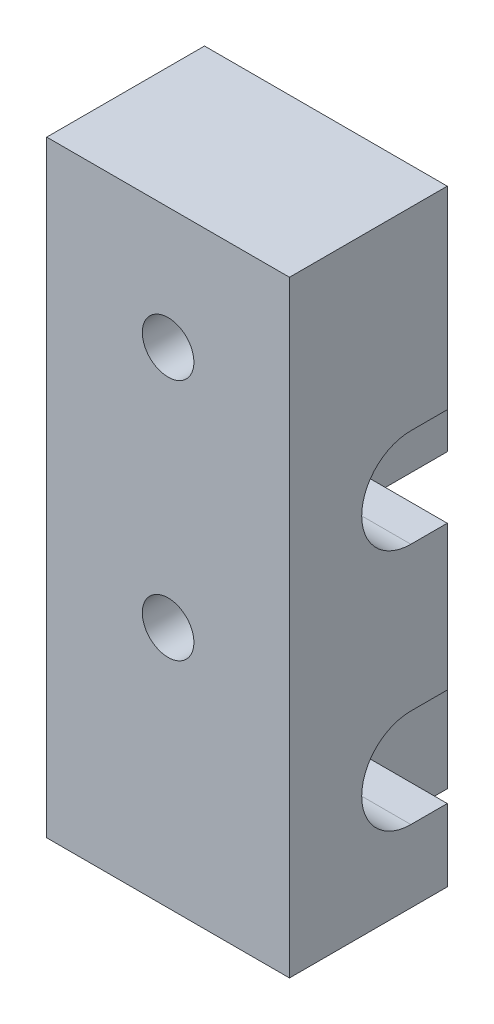
ISO-10303-21;
HEADER;
FILE_DESCRIPTION(('STEP AP214'),'2;1');
FILE_NAME('part.step','',(''),(''),'','','');
FILE_SCHEMA(('AUTOMOTIVE_DESIGN { 1 0 10303 214 1 1 1 1 }'));
ENDSEC;
DATA;
#1=APPLICATION_CONTEXT('core data for automotive mechanical design processes');
#2=APPLICATION_PROTOCOL_DEFINITION('international standard','automotive_design',2000,#1);
#3=PRODUCT_CONTEXT('',#1,'mechanical');
#4=PRODUCT('Part','Part','',(#3));
#5=PRODUCT_RELATED_PRODUCT_CATEGORY('part','',(#4));
#6=PRODUCT_DEFINITION_FORMATION('','',#4);
#7=PRODUCT_DEFINITION_CONTEXT('part definition',#1,'design');
#8=PRODUCT_DEFINITION('design','',#6,#7);
#9=PRODUCT_DEFINITION_SHAPE('','',#8);
#10=(LENGTH_UNIT() NAMED_UNIT(*) SI_UNIT(.MILLI.,.METRE.));
#11=(NAMED_UNIT(*) PLANE_ANGLE_UNIT() SI_UNIT($,.RADIAN.));
#12=(NAMED_UNIT(*) SI_UNIT($,.STERADIAN.) SOLID_ANGLE_UNIT());
#13=UNCERTAINTY_MEASURE_WITH_UNIT(LENGTH_MEASURE(1.E-05),#10,'distance_accuracy_value','');
#14=(GEOMETRIC_REPRESENTATION_CONTEXT(3) GLOBAL_UNCERTAINTY_ASSIGNED_CONTEXT((#13)) GLOBAL_UNIT_ASSIGNED_CONTEXT((#10,
#11,#12)) REPRESENTATION_CONTEXT('',''));
#15=CARTESIAN_POINT('',(0.,0.,0.));
#16=DIRECTION('',(0.,0.,1.));
#17=DIRECTION('',(1.,0.,0.));
#18=AXIS2_PLACEMENT_3D('',#15,#16,#17);
#19=CARTESIAN_POINT('',(20.,30.,10.));
#20=DIRECTION('',(-1.,0.,0.));
#21=DIRECTION('',(0.,0.,-1.));
#22=AXIS2_PLACEMENT_3D('',#19,#20,#21);
#23=CYLINDRICAL_SURFACE('',#22,4.05);
#24=CARTESIAN_POINT('',(8.,30.,10.));
#25=DIRECTION('',(-1.,0.,0.));
#26=DIRECTION('',(0.,0.,1.));
#27=AXIS2_PLACEMENT_3D('',#24,#25,#26);
#28=CIRCLE('',#27,4.05);
#29=CARTESIAN_POINT('',(8.,30.,14.05));
#30=VERTEX_POINT('',#29);
#31=EDGE_CURVE('E211',#30,#30,#28,.T.);
#32=ORIENTED_EDGE('',*,*,#31,.T.);
#33=EDGE_LOOP('',(#32));
#34=FACE_BOUND('',#33,.T.);
#35=CARTESIAN_POINT('',(20.,30.,10.));
#36=DIRECTION('',(1.,0.,0.));
#37=DIRECTION('',(0.,0.,-1.));
#38=AXIS2_PLACEMENT_3D('',#35,#36,#37);
#39=CIRCLE('',#38,4.05);
#40=CARTESIAN_POINT('',(20.,25.95,10.));
#41=VERTEX_POINT('',#40);
#42=CARTESIAN_POINT('',(20.,34.05,10.));
#43=VERTEX_POINT('',#42);
#44=EDGE_CURVE('E11',#41,#43,#39,.F.);
#45=ORIENTED_EDGE('',*,*,#44,.F.);
#46=DIRECTION('',(1.,0.,0.));
#47=VECTOR('',#46,1.);
#48=CARTESIAN_POINT('',(13.,25.95,10.));
#49=LINE('',#48,#47);
#50=CARTESIAN_POINT('',(13.,25.95,10.));
#51=VERTEX_POINT('',#50);
#52=EDGE_CURVE('E342',#51,#41,#49,.T.);
#53=ORIENTED_EDGE('',*,*,#52,.F.);
#54=CARTESIAN_POINT('',(13.,30.,10.));
#55=DIRECTION('',(1.,0.,0.));
#56=DIRECTION('',(0.,0.,-1.));
#57=AXIS2_PLACEMENT_3D('',#54,#55,#56);
#58=CIRCLE('',#57,4.05);
#59=CARTESIAN_POINT('',(13.,34.05,10.));
#60=VERTEX_POINT('',#59);
#61=EDGE_CURVE('E243',#60,#51,#58,.F.);
#62=ORIENTED_EDGE('',*,*,#61,.F.);
#63=DIRECTION('',(1.,0.,0.));
#64=VECTOR('',#63,1.);
#65=CARTESIAN_POINT('',(13.,34.05,10.));
#66=LINE('',#65,#64);
#67=EDGE_CURVE('E381',#60,#43,#66,.T.);
#68=ORIENTED_EDGE('',*,*,#67,.T.);
#69=EDGE_LOOP('',(#45,#53,#62,#68));
#70=FACE_BOUND('',#69,.T.);
#71=ADVANCED_FACE('F37',(#34,#70),#23,.F.);
#72=CARTESIAN_POINT('',(20.,10.,10.));
#73=DIRECTION('',(-1.,0.,0.));
#74=DIRECTION('',(0.,0.,-1.));
#75=AXIS2_PLACEMENT_3D('',#72,#73,#74);
#76=CYLINDRICAL_SURFACE('',#75,4.05);
#77=CARTESIAN_POINT('',(8.,10.,10.));
#78=DIRECTION('',(-1.,0.,0.));
#79=DIRECTION('',(0.,0.,1.));
#80=AXIS2_PLACEMENT_3D('',#77,#78,#79);
#81=CIRCLE('',#80,4.05);
#82=CARTESIAN_POINT('',(8.,10.,14.05));
#83=VERTEX_POINT('',#82);
#84=EDGE_CURVE('E236',#83,#83,#81,.T.);
#85=ORIENTED_EDGE('',*,*,#84,.T.);
#86=EDGE_LOOP('',(#85));
#87=FACE_BOUND('',#86,.T.);
#88=CARTESIAN_POINT('',(20.,10.,10.));
#89=DIRECTION('',(1.,0.,0.));
#90=DIRECTION('',(0.,0.,-1.));
#91=AXIS2_PLACEMENT_3D('',#88,#89,#90);
#92=CIRCLE('',#91,4.05);
#93=CARTESIAN_POINT('',(20.,5.95,10.));
#94=VERTEX_POINT('',#93);
#95=CARTESIAN_POINT('',(20.,14.05,10.));
#96=VERTEX_POINT('',#95);
#97=EDGE_CURVE('E46',#94,#96,#92,.F.);
#98=ORIENTED_EDGE('',*,*,#97,.F.);
#99=DIRECTION('',(1.,0.,0.));
#100=VECTOR('',#99,1.);
#101=CARTESIAN_POINT('',(13.,5.95,10.));
#102=LINE('',#101,#100);
#103=CARTESIAN_POINT('',(13.,5.95,10.));
#104=VERTEX_POINT('',#103);
#105=EDGE_CURVE('E385',#104,#94,#102,.T.);
#106=ORIENTED_EDGE('',*,*,#105,.F.);
#107=CARTESIAN_POINT('',(13.,10.,10.));
#108=DIRECTION('',(1.,0.,0.));
#109=DIRECTION('',(0.,0.,-1.));
#110=AXIS2_PLACEMENT_3D('',#107,#108,#109);
#111=CIRCLE('',#110,4.05);
#112=CARTESIAN_POINT('',(13.,14.05,10.));
#113=VERTEX_POINT('',#112);
#114=EDGE_CURVE('E213',#113,#104,#111,.F.);
#115=ORIENTED_EDGE('',*,*,#114,.F.);
#116=DIRECTION('',(1.,0.,0.));
#117=VECTOR('',#116,1.);
#118=CARTESIAN_POINT('',(13.,14.05,10.));
#119=LINE('',#118,#117);
#120=EDGE_CURVE('E331',#113,#96,#119,.T.);
#121=ORIENTED_EDGE('',*,*,#120,.T.);
#122=EDGE_LOOP('',(#98,#106,#115,#121));
#123=FACE_BOUND('',#122,.T.);
#124=ADVANCED_FACE('F389',(#87,#123),#76,.F.);
#125=CARTESIAN_POINT('',(10.,20.,0.));
#126=DIRECTION('',(0.,0.,1.));
#127=DIRECTION('',(-1.,0.,0.));
#128=AXIS2_PLACEMENT_3D('',#125,#126,#127);
#129=CYLINDRICAL_SURFACE('',#128,4.05);
#130=CARTESIAN_POINT('',(10.,20.,12.));
#131=DIRECTION('',(0.,0.,-1.));
#132=DIRECTION('',(-1.,0.,0.));
#133=AXIS2_PLACEMENT_3D('',#130,#131,#132);
#134=CIRCLE('',#133,4.05);
#135=CARTESIAN_POINT('',(5.95,20.,12.));
#136=VERTEX_POINT('',#135);
#137=EDGE_CURVE('E224',#136,#136,#134,.T.);
#138=ORIENTED_EDGE('',*,*,#137,.F.);
#139=EDGE_LOOP('',(#138));
#140=FACE_BOUND('',#139,.T.);
#141=CARTESIAN_POINT('',(10.,20.,7.));
#142=DIRECTION('',(0.,0.,-1.));
#143=DIRECTION('',(-1.,0.,0.));
#144=AXIS2_PLACEMENT_3D('',#141,#142,#143);
#145=CIRCLE('',#144,4.05);
#146=CARTESIAN_POINT('',(10.,24.05,7.));
#147=VERTEX_POINT('',#146);
#148=CARTESIAN_POINT('',(10.,15.95,7.));
#149=VERTEX_POINT('',#148);
#150=EDGE_CURVE('E216',#147,#149,#145,.T.);
#151=ORIENTED_EDGE('',*,*,#150,.T.);
#152=DIRECTION('',(0.,0.,-1.));
#153=VECTOR('',#152,1.);
#154=CARTESIAN_POINT('',(10.,15.95,7.));
#155=LINE('',#154,#153);
#156=CARTESIAN_POINT('',(10.,15.95,0.));
#157=VERTEX_POINT('',#156);
#158=EDGE_CURVE('E354',#149,#157,#155,.T.);
#159=ORIENTED_EDGE('',*,*,#158,.T.);
#160=CARTESIAN_POINT('',(10.,20.,0.));
#161=DIRECTION('',(0.,0.,-1.));
#162=DIRECTION('',(-1.,0.,0.));
#163=AXIS2_PLACEMENT_3D('',#160,#161,#162);
#164=CIRCLE('',#163,4.05);
#165=CARTESIAN_POINT('',(10.,24.05,0.));
#166=VERTEX_POINT('',#165);
#167=EDGE_CURVE('E217',#157,#166,#164,.T.);
#168=ORIENTED_EDGE('',*,*,#167,.T.);
#169=DIRECTION('',(0.,0.,-1.));
#170=VECTOR('',#169,1.);
#171=CARTESIAN_POINT('',(10.,24.05,7.));
#172=LINE('',#171,#170);
#173=EDGE_CURVE('E358',#147,#166,#172,.T.);
#174=ORIENTED_EDGE('',*,*,#173,.F.);
#175=EDGE_LOOP('',(#151,#159,#168,#174));
#176=FACE_BOUND('',#175,.T.);
#177=ADVANCED_FACE('F426',(#140,#176),#129,.F.);
#178=CARTESIAN_POINT('',(13.,40.,7.));
#179=DIRECTION('',(-1.,0.,0.));
#180=DIRECTION('',(0.,0.,-1.));
#181=AXIS2_PLACEMENT_3D('',#178,#179,#180);
#182=PLANE('',#181);
#183=DIRECTION('',(0.,-1.,0.));
#184=VECTOR('',#183,1.);
#185=CARTESIAN_POINT('',(13.,40.,7.));
#186=LINE('',#185,#184);
#187=CARTESIAN_POINT('',(13.,37.2792464279174,7.));
#188=VERTEX_POINT('',#187);
#189=CARTESIAN_POINT('',(13.,34.05,7.));
#190=VERTEX_POINT('',#189);
#191=EDGE_CURVE('E203',#188,#190,#186,.T.);
#192=ORIENTED_EDGE('',*,*,#191,.T.);
#193=DIRECTION('',(0.,0.,-1.));
#194=VECTOR('',#193,1.);
#195=CARTESIAN_POINT('',(13.,34.05,10.));
#196=LINE('',#195,#194);
#197=EDGE_CURVE('E392',#60,#190,#196,.T.);
#198=ORIENTED_EDGE('',*,*,#197,.F.);
#199=ORIENTED_EDGE('',*,*,#61,.T.);
#200=DIRECTION('',(0.,0.,1.));
#201=VECTOR('',#200,1.);
#202=CARTESIAN_POINT('',(13.,25.95,0.));
#203=LINE('',#202,#201);
#204=CARTESIAN_POINT('',(13.,25.95,7.));
#205=VERTEX_POINT('',#204);
#206=EDGE_CURVE('E62',#205,#51,#203,.T.);
#207=ORIENTED_EDGE('',*,*,#206,.F.);
#208=CARTESIAN_POINT('',(13.,24.05,7.));
#209=VERTEX_POINT('',#208);
#210=EDGE_CURVE('E305',#205,#209,#186,.T.);
#211=ORIENTED_EDGE('',*,*,#210,.T.);
#212=DIRECTION('',(0.,0.,1.));
#213=VECTOR('',#212,1.);
#214=CARTESIAN_POINT('',(13.,24.05,7.));
#215=LINE('',#214,#213);
#216=CARTESIAN_POINT('',(13.,24.05,0.));
#217=VERTEX_POINT('',#216);
#218=EDGE_CURVE('E197',#217,#209,#215,.T.);
#219=ORIENTED_EDGE('',*,*,#218,.F.);
#220=DIRECTION('',(0.,-1.,0.));
#221=VECTOR('',#220,1.);
#222=CARTESIAN_POINT('',(13.,40.,0.));
#223=LINE('',#222,#221);
#224=CARTESIAN_POINT('',(13.,37.2792464279174,0.));
#225=VERTEX_POINT('',#224);
#226=EDGE_CURVE('E178',#225,#217,#223,.T.);
#227=ORIENTED_EDGE('',*,*,#226,.F.);
#228=DIRECTION('',(0.,0.,1.));
#229=VECTOR('',#228,1.);
#230=CARTESIAN_POINT('',(13.,37.2792464279174,0.));
#231=LINE('',#230,#229);
#232=EDGE_CURVE('E185',#188,#225,#231,.F.);
#233=ORIENTED_EDGE('',*,*,#232,.F.);
#234=EDGE_LOOP('',(#192,#198,#199,#207,#211,#219,#227,#233));
#235=FACE_BOUND('',#234,.T.);
#236=ADVANCED_FACE('F194',(#235),#182,.F.);
#237=CARTESIAN_POINT('',(20.,40.,7.));
#238=DIRECTION('',(0.,0.,1.));
#239=DIRECTION('',(-1.,0.,0.));
#240=AXIS2_PLACEMENT_3D('',#237,#238,#239);
#241=PLANE('',#240);
#242=DIRECTION('',(0.,-1.,0.));
#243=VECTOR('',#242,1.);
#244=CARTESIAN_POINT('',(20.,40.,7.));
#245=LINE('',#244,#243);
#246=CARTESIAN_POINT('',(20.,25.95,7.));
#247=VERTEX_POINT('',#246);
#248=CARTESIAN_POINT('',(20.,14.05,7.));
#249=VERTEX_POINT('',#248);
#250=EDGE_CURVE('E300',#247,#249,#245,.T.);
#251=ORIENTED_EDGE('',*,*,#250,.T.);
#252=DIRECTION('',(1.,0.,0.));
#253=VECTOR('',#252,1.);
#254=CARTESIAN_POINT('',(20.,14.05,7.));
#255=LINE('',#254,#253);
#256=CARTESIAN_POINT('',(13.,14.05,7.));
#257=VERTEX_POINT('',#256);
#258=EDGE_CURVE('E336',#257,#249,#255,.T.);
#259=ORIENTED_EDGE('',*,*,#258,.F.);
#260=CARTESIAN_POINT('',(13.,15.95,7.));
#261=VERTEX_POINT('',#260);
#262=EDGE_CURVE('E304',#261,#257,#186,.T.);
#263=ORIENTED_EDGE('',*,*,#262,.F.);
#264=DIRECTION('',(1.,0.,0.));
#265=VECTOR('',#264,1.);
#266=CARTESIAN_POINT('',(18.,15.95,7.));
#267=LINE('',#266,#265);
#268=EDGE_CURVE('E348',#149,#261,#267,.T.);
#269=ORIENTED_EDGE('',*,*,#268,.F.);
#270=ORIENTED_EDGE('',*,*,#150,.F.);
#271=DIRECTION('',(-1.,0.,0.));
#272=VECTOR('',#271,1.);
#273=CARTESIAN_POINT('',(10.,24.05,7.));
#274=LINE('',#273,#272);
#275=EDGE_CURVE('E351',#209,#147,#274,.T.);
#276=ORIENTED_EDGE('',*,*,#275,.F.);
#277=ORIENTED_EDGE('',*,*,#210,.F.);
#278=DIRECTION('',(-1.,0.,0.));
#279=VECTOR('',#278,1.);
#280=CARTESIAN_POINT('',(20.,25.95,7.));
#281=LINE('',#280,#279);
#282=EDGE_CURVE('E339',#247,#205,#281,.T.);
#283=ORIENTED_EDGE('',*,*,#282,.F.);
#284=EDGE_LOOP('',(#251,#259,#263,#269,#270,#276,#277,#283));
#285=FACE_BOUND('',#284,.T.);
#286=ADVANCED_FACE('F372',(#285),#241,.F.);
#287=DIRECTION('',(1.,0.,0.));
#288=VECTOR('',#287,1.);
#289=CARTESIAN_POINT('',(20.,40.,7.));
#290=LINE('',#289,#288);
#291=CARTESIAN_POINT('',(0.,40.,7.));
#292=VERTEX_POINT('',#291);
#293=CARTESIAN_POINT('',(5.95,40.,7.));
#294=VERTEX_POINT('',#293);
#295=EDGE_CURVE('E249',#292,#294,#290,.T.);
#296=ORIENTED_EDGE('',*,*,#295,.F.);
#297=DIRECTION('',(0.,-1.,0.));
#298=VECTOR('',#297,1.);
#299=CARTESIAN_POINT('',(0.,50.,7.));
#300=LINE('',#299,#298);
#301=CARTESIAN_POINT('',(0.,50.,7.));
#302=VERTEX_POINT('',#301);
#303=EDGE_CURVE('E263',#302,#292,#300,.T.);
#304=ORIENTED_EDGE('',*,*,#303,.F.);
#305=DIRECTION('',(1.,0.,0.));
#306=VECTOR('',#305,1.);
#307=CARTESIAN_POINT('',(20.,50.,7.));
#308=LINE('',#307,#306);
#309=CARTESIAN_POINT('',(20.,50.,7.));
#310=VERTEX_POINT('',#309);
#311=EDGE_CURVE('E260',#302,#310,#308,.T.);
#312=ORIENTED_EDGE('',*,*,#311,.T.);
#313=CARTESIAN_POINT('',(20.,34.05,7.));
#314=VERTEX_POINT('',#313);
#315=EDGE_CURVE('E297',#310,#314,#245,.T.);
#316=ORIENTED_EDGE('',*,*,#315,.T.);
#317=DIRECTION('',(1.,0.,0.));
#318=VECTOR('',#317,1.);
#319=CARTESIAN_POINT('',(20.,34.05,7.));
#320=LINE('',#319,#318);
#321=EDGE_CURVE('E335',#190,#314,#320,.T.);
#322=ORIENTED_EDGE('',*,*,#321,.F.);
#323=ORIENTED_EDGE('',*,*,#191,.F.);
#324=CARTESIAN_POINT('',(9.99999999999999,40.,7.));
#325=DIRECTION('',(0.,0.,-1.));
#326=DIRECTION('',(-1.,0.,0.));
#327=AXIS2_PLACEMENT_3D('',#324,#325,#326);
#328=CIRCLE('',#327,4.05);
#329=EDGE_CURVE('E188',#294,#188,#328,.T.);
#330=ORIENTED_EDGE('',*,*,#329,.F.);
#331=EDGE_LOOP('',(#296,#304,#312,#316,#322,#323,#330));
#332=FACE_BOUND('',#331,.T.);
#333=ADVANCED_FACE('F408',(#332),#241,.F.);
#334=CARTESIAN_POINT('',(20.,5.95,7.));
#335=VERTEX_POINT('',#334);
#336=CARTESIAN_POINT('',(20.,0.,7.));
#337=VERTEX_POINT('',#336);
#338=EDGE_CURVE('E296',#335,#337,#245,.T.);
#339=ORIENTED_EDGE('',*,*,#338,.T.);
#340=DIRECTION('',(1.,0.,0.));
#341=VECTOR('',#340,1.);
#342=CARTESIAN_POINT('',(20.,0.,7.));
#343=LINE('',#342,#341);
#344=CARTESIAN_POINT('',(13.,0.,7.));
#345=VERTEX_POINT('',#344);
#346=EDGE_CURVE('E279',#345,#337,#343,.T.);
#347=ORIENTED_EDGE('',*,*,#346,.F.);
#348=CARTESIAN_POINT('',(13.,5.95,7.));
#349=VERTEX_POINT('',#348);
#350=EDGE_CURVE('E299',#349,#345,#186,.T.);
#351=ORIENTED_EDGE('',*,*,#350,.F.);
#352=DIRECTION('',(-1.,0.,0.));
#353=VECTOR('',#352,1.);
#354=CARTESIAN_POINT('',(20.,5.95,7.));
#355=LINE('',#354,#353);
#356=EDGE_CURVE('E315',#335,#349,#355,.T.);
#357=ORIENTED_EDGE('',*,*,#356,.F.);
#358=EDGE_LOOP('',(#339,#347,#351,#357));
#359=FACE_BOUND('',#358,.T.);
#360=ADVANCED_FACE('F312',(#359),#241,.F.);
#361=CARTESIAN_POINT('',(0.,10.,10.));
#362=DIRECTION('',(1.,0.,0.));
#363=DIRECTION('',(0.,0.,1.));
#364=AXIS2_PLACEMENT_3D('',#361,#362,#363);
#365=CYLINDRICAL_SURFACE('',#364,2.125);
#366=CARTESIAN_POINT('',(0.,10.,10.));
#367=DIRECTION('',(-1.,0.,0.));
#368=DIRECTION('',(0.,0.,1.));
#369=AXIS2_PLACEMENT_3D('',#366,#367,#368);
#370=CIRCLE('',#369,2.125);
#371=CARTESIAN_POINT('',(0.,10.,12.125));
#372=VERTEX_POINT('',#371);
#373=EDGE_CURVE('E245',#372,#372,#370,.T.);
#374=CARTESIAN_POINT('',(8.,10.,10.));
#375=DIRECTION('',(-1.,0.,0.));
#376=DIRECTION('',(0.,0.,1.));
#377=AXIS2_PLACEMENT_3D('',#374,#375,#376);
#378=CIRCLE('',#377,2.125);
#379=CARTESIAN_POINT('',(8.,10.,12.125));
#380=VERTEX_POINT('',#379);
#381=EDGE_CURVE('E210',#380,#380,#378,.F.);
#382=CARTESIAN_POINT('',(0.,10.,12.125));
#383=CARTESIAN_POINT('',(0.0833333333333314,10.,12.125));
#384=CARTESIAN_POINT('',(0.166666666666665,10.,12.125));
#385=CARTESIAN_POINT('',(0.333333333333331,10.,12.125));
#386=CARTESIAN_POINT('',(0.416666666666665,10.,12.125));
#387=CARTESIAN_POINT('',(0.583333333333331,10.,12.125));
#388=CARTESIAN_POINT('',(0.666666666666665,10.,12.125));
#389=CARTESIAN_POINT('',(0.833333333333331,10.,12.125));
#390=CARTESIAN_POINT('',(0.916666666666665,10.,12.125));
#391=CARTESIAN_POINT('',(1.08333333333333,10.,12.125));
#392=CARTESIAN_POINT('',(1.16666666666666,10.,12.125));
#393=CARTESIAN_POINT('',(1.33333333333333,10.,12.125));
#394=CARTESIAN_POINT('',(1.41666666666666,10.,12.125));
#395=CARTESIAN_POINT('',(1.58333333333333,10.,12.125));
#396=CARTESIAN_POINT('',(1.66666666666666,10.,12.125));
#397=CARTESIAN_POINT('',(1.83333333333333,10.,12.125));
#398=CARTESIAN_POINT('',(1.91666666666666,10.,12.125));
#399=CARTESIAN_POINT('',(2.08333333333333,10.,12.125));
#400=CARTESIAN_POINT('',(2.16666666666666,10.,12.125));
#401=CARTESIAN_POINT('',(2.33333333333333,10.,12.125));
#402=CARTESIAN_POINT('',(2.41666666666666,10.,12.125));
#403=CARTESIAN_POINT('',(2.58333333333333,10.,12.125));
#404=CARTESIAN_POINT('',(2.66666666666666,10.,12.125));
#405=CARTESIAN_POINT('',(2.83333333333333,10.,12.125));
#406=CARTESIAN_POINT('',(2.91666666666666,10.,12.125));
#407=CARTESIAN_POINT('',(3.08333333333333,10.,12.125));
#408=CARTESIAN_POINT('',(3.16666666666666,10.,12.125));
#409=CARTESIAN_POINT('',(3.33333333333333,10.,12.125));
#410=CARTESIAN_POINT('',(3.41666666666666,10.,12.125));
#411=CARTESIAN_POINT('',(3.58333333333333,10.,12.125));
#412=CARTESIAN_POINT('',(3.66666666666666,10.,12.125));
#413=CARTESIAN_POINT('',(3.83333333333333,10.,12.125));
#414=CARTESIAN_POINT('',(3.91666666666666,10.,12.125));
#415=CARTESIAN_POINT('',(4.08333333333333,10.,12.125));
#416=CARTESIAN_POINT('',(4.16666666666666,10.,12.125));
#417=CARTESIAN_POINT('',(4.33333333333333,10.,12.125));
#418=CARTESIAN_POINT('',(4.41666666666666,10.,12.125));
#419=CARTESIAN_POINT('',(4.58333333333333,10.,12.125));
#420=CARTESIAN_POINT('',(4.66666666666666,10.,12.125));
#421=CARTESIAN_POINT('',(4.83333333333333,10.,12.125));
#422=CARTESIAN_POINT('',(4.91666666666666,10.,12.125));
#423=CARTESIAN_POINT('',(5.08333333333333,10.,12.125));
#424=CARTESIAN_POINT('',(5.16666666666666,10.,12.125));
#425=CARTESIAN_POINT('',(5.33333333333333,10.,12.125));
#426=CARTESIAN_POINT('',(5.41666666666666,10.,12.125));
#427=CARTESIAN_POINT('',(5.58333333333333,10.,12.125));
#428=CARTESIAN_POINT('',(5.66666666666666,10.,12.125));
#429=CARTESIAN_POINT('',(5.83333333333333,10.,12.125));
#430=CARTESIAN_POINT('',(5.91666666666666,10.,12.125));
#431=CARTESIAN_POINT('',(6.08333333333333,10.,12.125));
#432=CARTESIAN_POINT('',(6.16666666666666,10.,12.125));
#433=CARTESIAN_POINT('',(6.33333333333333,10.,12.125));
#434=CARTESIAN_POINT('',(6.41666666666666,10.,12.125));
#435=CARTESIAN_POINT('',(6.58333333333333,10.,12.125));
#436=CARTESIAN_POINT('',(6.66666666666666,10.,12.125));
#437=CARTESIAN_POINT('',(6.83333333333333,10.,12.125));
#438=CARTESIAN_POINT('',(6.91666666666666,10.,12.125));
#439=CARTESIAN_POINT('',(7.08333333333333,10.,12.125));
#440=CARTESIAN_POINT('',(7.16666666666666,10.,12.125));
#441=CARTESIAN_POINT('',(7.33333333333333,10.,12.125));
#442=CARTESIAN_POINT('',(7.41666666666666,10.,12.125));
#443=CARTESIAN_POINT('',(7.58333333333333,10.,12.125));
#444=CARTESIAN_POINT('',(7.66666666666666,10.,12.125));
#445=CARTESIAN_POINT('',(7.83333333333333,10.,12.125));
#446=CARTESIAN_POINT('',(7.91666666666666,10.,12.125));
#447=CARTESIAN_POINT('',(8.,10.,12.125));
#448=B_SPLINE_CURVE_WITH_KNOTS('',3,(#382,#383,#384,#385,#386,#387,#388,#389,#390,#391,#392,
#393,#394,#395,#396,#397,#398,#399,#400,#401,#402,#403,#404,#405,#406,#407,#408,#409,#410,#411,
#412,#413,#414,#415,#416,#417,#418,#419,#420,#421,#422,#423,#424,#425,#426,#427,#428,#429,#430,
#431,#432,#433,#434,#435,#436,#437,#438,#439,#440,#441,#442,#443,#444,#445,#446,#447),
.UNSPECIFIED.,.F.,.F.,(4,2,2,2,2,2,2,2,2,2,2,2,2,2,2,2,2,2,2,2,2,2,2,2,2,2,2,2,2,2,2,2,4),(0.,
0.25,0.5,0.75,1.,1.25,1.5,1.75,2.,2.25,2.5,2.75,3.,3.25,3.5,3.75,4.,4.25,4.5,4.75,5.,5.25,5.5,
5.75,6.,6.25,6.5,6.75,7.,7.25,7.5,7.75,8.),.UNSPECIFIED.);
#449=EDGE_CURVE('BSEAM455',#372,#380,#448,.T.);
#450=ORIENTED_EDGE('',*,*,#373,.T.);
#451=ORIENTED_EDGE('',*,*,#381,.T.);
#452=ORIENTED_EDGE('',*,*,#449,.T.);
#453=ORIENTED_EDGE('',*,*,#449,.F.);
#454=EDGE_LOOP('',(#450,#452,#451,#453));
#455=FACE_BOUND('',#454,.T.);
#456=ADVANCED_FACE('F455',(#455),#365,.F.);
#457=CARTESIAN_POINT('',(0.,30.,10.));
#458=DIRECTION('',(1.,0.,0.));
#459=DIRECTION('',(0.,0.,1.));
#460=AXIS2_PLACEMENT_3D('',#457,#458,#459);
#461=CYLINDRICAL_SURFACE('',#460,2.125);
#462=CARTESIAN_POINT('',(0.,30.,10.));
#463=DIRECTION('',(-1.,0.,0.));
#464=DIRECTION('',(0.,0.,1.));
#465=AXIS2_PLACEMENT_3D('',#462,#463,#464);
#466=CIRCLE('',#465,2.125);
#467=CARTESIAN_POINT('',(0.,30.,12.125));
#468=VERTEX_POINT('',#467);
#469=EDGE_CURVE('E246',#468,#468,#466,.T.);
#470=CARTESIAN_POINT('',(8.,30.,10.));
#471=DIRECTION('',(-1.,0.,0.));
#472=DIRECTION('',(0.,0.,1.));
#473=AXIS2_PLACEMENT_3D('',#470,#471,#472);
#474=CIRCLE('',#473,2.125);
#475=CARTESIAN_POINT('',(8.,30.,12.125));
#476=VERTEX_POINT('',#475);
#477=EDGE_CURVE('E207',#476,#476,#474,.F.);
#478=CARTESIAN_POINT('',(0.,30.,12.125));
#479=CARTESIAN_POINT('',(0.0833333333333314,30.,12.125));
#480=CARTESIAN_POINT('',(0.166666666666665,30.,12.125));
#481=CARTESIAN_POINT('',(0.333333333333331,30.,12.125));
#482=CARTESIAN_POINT('',(0.416666666666665,30.,12.125));
#483=CARTESIAN_POINT('',(0.583333333333331,30.,12.125));
#484=CARTESIAN_POINT('',(0.666666666666665,30.,12.125));
#485=CARTESIAN_POINT('',(0.833333333333331,30.,12.125));
#486=CARTESIAN_POINT('',(0.916666666666665,30.,12.125));
#487=CARTESIAN_POINT('',(1.08333333333333,30.,12.125));
#488=CARTESIAN_POINT('',(1.16666666666666,30.,12.125));
#489=CARTESIAN_POINT('',(1.33333333333333,30.,12.125));
#490=CARTESIAN_POINT('',(1.41666666666666,30.,12.125));
#491=CARTESIAN_POINT('',(1.58333333333333,30.,12.125));
#492=CARTESIAN_POINT('',(1.66666666666666,30.,12.125));
#493=CARTESIAN_POINT('',(1.83333333333333,30.,12.125));
#494=CARTESIAN_POINT('',(1.91666666666666,30.,12.125));
#495=CARTESIAN_POINT('',(2.08333333333333,30.,12.125));
#496=CARTESIAN_POINT('',(2.16666666666666,30.,12.125));
#497=CARTESIAN_POINT('',(2.33333333333333,30.,12.125));
#498=CARTESIAN_POINT('',(2.41666666666666,30.,12.125));
#499=CARTESIAN_POINT('',(2.58333333333333,30.,12.125));
#500=CARTESIAN_POINT('',(2.66666666666666,30.,12.125));
#501=CARTESIAN_POINT('',(2.83333333333333,30.,12.125));
#502=CARTESIAN_POINT('',(2.91666666666666,30.,12.125));
#503=CARTESIAN_POINT('',(3.08333333333333,30.,12.125));
#504=CARTESIAN_POINT('',(3.16666666666666,30.,12.125));
#505=CARTESIAN_POINT('',(3.33333333333333,30.,12.125));
#506=CARTESIAN_POINT('',(3.41666666666666,30.,12.125));
#507=CARTESIAN_POINT('',(3.58333333333333,30.,12.125));
#508=CARTESIAN_POINT('',(3.66666666666666,30.,12.125));
#509=CARTESIAN_POINT('',(3.83333333333333,30.,12.125));
#510=CARTESIAN_POINT('',(3.91666666666666,30.,12.125));
#511=CARTESIAN_POINT('',(4.08333333333333,30.,12.125));
#512=CARTESIAN_POINT('',(4.16666666666666,30.,12.125));
#513=CARTESIAN_POINT('',(4.33333333333333,30.,12.125));
#514=CARTESIAN_POINT('',(4.41666666666666,30.,12.125));
#515=CARTESIAN_POINT('',(4.58333333333333,30.,12.125));
#516=CARTESIAN_POINT('',(4.66666666666666,30.,12.125));
#517=CARTESIAN_POINT('',(4.83333333333333,30.,12.125));
#518=CARTESIAN_POINT('',(4.91666666666666,30.,12.125));
#519=CARTESIAN_POINT('',(5.08333333333333,30.,12.125));
#520=CARTESIAN_POINT('',(5.16666666666666,30.,12.125));
#521=CARTESIAN_POINT('',(5.33333333333333,30.,12.125));
#522=CARTESIAN_POINT('',(5.41666666666666,30.,12.125));
#523=CARTESIAN_POINT('',(5.58333333333333,30.,12.125));
#524=CARTESIAN_POINT('',(5.66666666666666,30.,12.125));
#525=CARTESIAN_POINT('',(5.83333333333333,30.,12.125));
#526=CARTESIAN_POINT('',(5.91666666666666,30.,12.125));
#527=CARTESIAN_POINT('',(6.08333333333333,30.,12.125));
#528=CARTESIAN_POINT('',(6.16666666666666,30.,12.125));
#529=CARTESIAN_POINT('',(6.33333333333333,30.,12.125));
#530=CARTESIAN_POINT('',(6.41666666666666,30.,12.125));
#531=CARTESIAN_POINT('',(6.58333333333333,30.,12.125));
#532=CARTESIAN_POINT('',(6.66666666666666,30.,12.125));
#533=CARTESIAN_POINT('',(6.83333333333333,30.,12.125));
#534=CARTESIAN_POINT('',(6.91666666666666,30.,12.125));
#535=CARTESIAN_POINT('',(7.08333333333333,30.,12.125));
#536=CARTESIAN_POINT('',(7.16666666666666,30.,12.125));
#537=CARTESIAN_POINT('',(7.33333333333333,30.,12.125));
#538=CARTESIAN_POINT('',(7.41666666666666,30.,12.125));
#539=CARTESIAN_POINT('',(7.58333333333333,30.,12.125));
#540=CARTESIAN_POINT('',(7.66666666666666,30.,12.125));
#541=CARTESIAN_POINT('',(7.83333333333333,30.,12.125));
#542=CARTESIAN_POINT('',(7.91666666666666,30.,12.125));
#543=CARTESIAN_POINT('',(8.,30.,12.125));
#544=B_SPLINE_CURVE_WITH_KNOTS('',3,(#478,#479,#480,#481,#482,#483,#484,#485,#486,#487,#488,
#489,#490,#491,#492,#493,#494,#495,#496,#497,#498,#499,#500,#501,#502,#503,#504,#505,#506,#507,
#508,#509,#510,#511,#512,#513,#514,#515,#516,#517,#518,#519,#520,#521,#522,#523,#524,#525,#526,
#527,#528,#529,#530,#531,#532,#533,#534,#535,#536,#537,#538,#539,#540,#541,#542,#543),
.UNSPECIFIED.,.F.,.F.,(4,2,2,2,2,2,2,2,2,2,2,2,2,2,2,2,2,2,2,2,2,2,2,2,2,2,2,2,2,2,2,2,4),(0.,
0.25,0.5,0.75,1.,1.25,1.5,1.75,2.,2.25,2.5,2.75,3.,3.25,3.5,3.75,4.,4.25,4.5,4.75,5.,5.25,5.5,
5.75,6.,6.25,6.5,6.75,7.,7.25,7.5,7.75,8.),.UNSPECIFIED.);
#545=EDGE_CURVE('BSEAM452',#468,#476,#544,.T.);
#546=ORIENTED_EDGE('',*,*,#469,.T.);
#547=ORIENTED_EDGE('',*,*,#477,.T.);
#548=ORIENTED_EDGE('',*,*,#545,.T.);
#549=ORIENTED_EDGE('',*,*,#545,.F.);
#550=EDGE_LOOP('',(#546,#548,#547,#549));
#551=FACE_BOUND('',#550,.T.);
#552=ADVANCED_FACE('F452',(#551),#461,.F.);
#553=CARTESIAN_POINT('',(0.,40.,0.));
#554=DIRECTION('',(0.,-1.,0.));
#555=DIRECTION('',(0.,0.,1.));
#556=AXIS2_PLACEMENT_3D('',#553,#554,#555);
#557=PLANE('',#556);
#558=DIRECTION('',(1.,0.,0.));
#559=VECTOR('',#558,1.);
#560=CARTESIAN_POINT('',(13.,40.,0.));
#561=LINE('',#560,#559);
#562=CARTESIAN_POINT('',(0.,40.,0.));
#563=VERTEX_POINT('',#562);
#564=CARTESIAN_POINT('',(5.95,40.,0.));
#565=VERTEX_POINT('',#564);
#566=EDGE_CURVE('E181',#563,#565,#561,.T.);
#567=ORIENTED_EDGE('',*,*,#566,.F.);
#568=DIRECTION('',(0.,0.,-1.));
#569=VECTOR('',#568,1.);
#570=CARTESIAN_POINT('',(0.,40.,0.));
#571=LINE('',#570,#569);
#572=EDGE_CURVE('E270',#292,#563,#571,.T.);
#573=ORIENTED_EDGE('',*,*,#572,.F.);
#574=ORIENTED_EDGE('',*,*,#295,.T.);
#575=DIRECTION('',(0.,0.,1.));
#576=VECTOR('',#575,1.);
#577=CARTESIAN_POINT('',(5.95,40.,0.));
#578=LINE('',#577,#576);
#579=EDGE_CURVE('E410',#565,#294,#578,.T.);
#580=ORIENTED_EDGE('',*,*,#579,.F.);
#581=EDGE_LOOP('',(#567,#573,#574,#580));
#582=FACE_BOUND('',#581,.T.);
#583=ADVANCED_FACE('F413',(#582),#557,.F.);
#584=CARTESIAN_POINT('',(13.,40.,0.));
#585=DIRECTION('',(0.,0.,1.));
#586=DIRECTION('',(-1.,0.,0.));
#587=AXIS2_PLACEMENT_3D('',#584,#585,#586);
#588=PLANE('',#587);
#589=ORIENTED_EDGE('',*,*,#226,.T.);
#590=DIRECTION('',(-1.,0.,0.));
#591=VECTOR('',#590,1.);
#592=CARTESIAN_POINT('',(10.,24.05,0.));
#593=LINE('',#592,#591);
#594=EDGE_CURVE('E352',#217,#166,#593,.T.);
#595=ORIENTED_EDGE('',*,*,#594,.T.);
#596=ORIENTED_EDGE('',*,*,#167,.F.);
#597=DIRECTION('',(1.,0.,0.));
#598=VECTOR('',#597,1.);
#599=CARTESIAN_POINT('',(18.,15.95,0.));
#600=LINE('',#599,#598);
#601=CARTESIAN_POINT('',(13.,15.95,0.));
#602=VERTEX_POINT('',#601);
#603=EDGE_CURVE('E347',#157,#602,#600,.T.);
#604=ORIENTED_EDGE('',*,*,#603,.T.);
#605=CARTESIAN_POINT('',(13.,0.,0.));
#606=VERTEX_POINT('',#605);
#607=EDGE_CURVE('E198',#602,#606,#223,.T.);
#608=ORIENTED_EDGE('',*,*,#607,.T.);
#609=DIRECTION('',(1.,0.,0.));
#610=VECTOR('',#609,1.);
#611=CARTESIAN_POINT('',(13.,0.,0.));
#612=LINE('',#611,#610);
#613=CARTESIAN_POINT('',(0.,0.,0.));
#614=VERTEX_POINT('',#613);
#615=EDGE_CURVE('E268',#614,#606,#612,.T.);
#616=ORIENTED_EDGE('',*,*,#615,.F.);
#617=DIRECTION('',(0.,-1.,0.));
#618=VECTOR('',#617,1.);
#619=CARTESIAN_POINT('',(0.,40.,0.));
#620=LINE('',#619,#618);
#621=EDGE_CURVE('E274',#563,#614,#620,.T.);
#622=ORIENTED_EDGE('',*,*,#621,.F.);
#623=ORIENTED_EDGE('',*,*,#566,.T.);
#624=CARTESIAN_POINT('',(9.99999999999999,40.,0.));
#625=DIRECTION('',(0.,0.,-1.));
#626=DIRECTION('',(-1.,0.,0.));
#627=AXIS2_PLACEMENT_3D('',#624,#625,#626);
#628=CIRCLE('',#627,4.05);
#629=EDGE_CURVE('E54',#225,#565,#628,.T.);
#630=ORIENTED_EDGE('',*,*,#629,.F.);
#631=EDGE_LOOP('',(#589,#595,#596,#604,#608,#616,#622,#623,#630));
#632=FACE_BOUND('',#631,.T.);
#633=ADVANCED_FACE('F39',(#632),#588,.F.);
#634=ORIENTED_EDGE('',*,*,#607,.F.);
#635=DIRECTION('',(0.,0.,-1.));
#636=VECTOR('',#635,1.);
#637=CARTESIAN_POINT('',(13.,15.95,7.));
#638=LINE('',#637,#636);
#639=EDGE_CURVE('E361',#261,#602,#638,.T.);
#640=ORIENTED_EDGE('',*,*,#639,.F.);
#641=ORIENTED_EDGE('',*,*,#262,.T.);
#642=DIRECTION('',(0.,0.,-1.));
#643=VECTOR('',#642,1.);
#644=CARTESIAN_POINT('',(13.,14.05,10.));
#645=LINE('',#644,#643);
#646=EDGE_CURVE('E332',#113,#257,#645,.T.);
#647=ORIENTED_EDGE('',*,*,#646,.F.);
#648=ORIENTED_EDGE('',*,*,#114,.T.);
#649=DIRECTION('',(0.,0.,1.));
#650=VECTOR('',#649,1.);
#651=CARTESIAN_POINT('',(13.,5.95,0.));
#652=LINE('',#651,#650);
#653=EDGE_CURVE('E327',#349,#104,#652,.T.);
#654=ORIENTED_EDGE('',*,*,#653,.F.);
#655=ORIENTED_EDGE('',*,*,#350,.T.);
#656=DIRECTION('',(0.,0.,1.));
#657=VECTOR('',#656,1.);
#658=CARTESIAN_POINT('',(13.,0.,7.));
#659=LINE('',#658,#657);
#660=EDGE_CURVE('E277',#606,#345,#659,.T.);
#661=ORIENTED_EDGE('',*,*,#660,.F.);
#662=EDGE_LOOP('',(#634,#640,#641,#647,#648,#654,#655,#661));
#663=FACE_BOUND('',#662,.T.);
#664=ADVANCED_FACE('F326',(#663),#182,.F.);
#665=CARTESIAN_POINT('',(20.,40.,20.));
#666=DIRECTION('',(-1.,0.,0.));
#667=DIRECTION('',(0.,0.,-1.));
#668=AXIS2_PLACEMENT_3D('',#665,#666,#667);
#669=PLANE('',#668);
#670=ORIENTED_EDGE('',*,*,#44,.T.);
#671=DIRECTION('',(0.,0.,-1.));
#672=VECTOR('',#671,1.);
#673=CARTESIAN_POINT('',(20.,34.05,10.));
#674=LINE('',#673,#672);
#675=EDGE_CURVE('E386',#43,#314,#674,.T.);
#676=ORIENTED_EDGE('',*,*,#675,.T.);
#677=ORIENTED_EDGE('',*,*,#315,.F.);
#678=DIRECTION('',(0.,0.,1.));
#679=VECTOR('',#678,1.);
#680=CARTESIAN_POINT('',(20.,50.,7.));
#681=LINE('',#680,#679);
#682=CARTESIAN_POINT('',(20.,50.,20.));
#683=VERTEX_POINT('',#682);
#684=EDGE_CURVE('E252',#310,#683,#681,.T.);
#685=ORIENTED_EDGE('',*,*,#684,.T.);
#686=DIRECTION('',(0.,-1.,0.));
#687=VECTOR('',#686,1.);
#688=CARTESIAN_POINT('',(20.,40.,20.));
#689=LINE('',#688,#687);
#690=CARTESIAN_POINT('',(20.,0.,20.));
#691=VERTEX_POINT('',#690);
#692=EDGE_CURVE('E294',#683,#691,#689,.T.);
#693=ORIENTED_EDGE('',*,*,#692,.T.);
#694=DIRECTION('',(0.,0.,1.));
#695=VECTOR('',#694,1.);
#696=CARTESIAN_POINT('',(20.,0.,20.));
#697=LINE('',#696,#695);
#698=EDGE_CURVE('E282',#337,#691,#697,.T.);
#699=ORIENTED_EDGE('',*,*,#698,.F.);
#700=ORIENTED_EDGE('',*,*,#338,.F.);
#701=DIRECTION('',(0.,0.,1.));
#702=VECTOR('',#701,1.);
#703=CARTESIAN_POINT('',(20.,5.95,0.));
#704=LINE('',#703,#702);
#705=EDGE_CURVE('E318',#335,#94,#704,.T.);
#706=ORIENTED_EDGE('',*,*,#705,.T.);
#707=ORIENTED_EDGE('',*,*,#97,.T.);
#708=DIRECTION('',(0.,0.,-1.));
#709=VECTOR('',#708,1.);
#710=CARTESIAN_POINT('',(20.,14.05,10.));
#711=LINE('',#710,#709);
#712=EDGE_CURVE('E376',#96,#249,#711,.T.);
#713=ORIENTED_EDGE('',*,*,#712,.T.);
#714=ORIENTED_EDGE('',*,*,#250,.F.);
#715=DIRECTION('',(0.,0.,1.));
#716=VECTOR('',#715,1.);
#717=CARTESIAN_POINT('',(20.,25.95,0.));
#718=LINE('',#717,#716);
#719=EDGE_CURVE('E390',#247,#41,#718,.T.);
#720=ORIENTED_EDGE('',*,*,#719,.T.);
#721=EDGE_LOOP('',(#670,#676,#677,#685,#693,#699,#700,#706,#707,#713,#714,#720));
#722=FACE_BOUND('',#721,.T.);
#723=ADVANCED_FACE('F317',(#722),#669,.F.);
#724=CARTESIAN_POINT('',(0.,40.,20.));
#725=DIRECTION('',(0.,0.,-1.));
#726=DIRECTION('',(1.,0.,0.));
#727=AXIS2_PLACEMENT_3D('',#724,#725,#726);
#728=PLANE('',#727);
#729=CARTESIAN_POINT('',(9.99999999999999,40.,20.));
#730=DIRECTION('',(0.,0.,1.));
#731=DIRECTION('',(1.,0.,0.));
#732=AXIS2_PLACEMENT_3D('',#729,#730,#731);
#733=CIRCLE('',#732,2.125);
#734=CARTESIAN_POINT('',(12.125,40.,20.));
#735=VERTEX_POINT('',#734);
#736=EDGE_CURVE('E192',#735,#735,#733,.T.);
#737=ORIENTED_EDGE('',*,*,#736,.F.);
#738=EDGE_LOOP('',(#737));
#739=FACE_BOUND('',#738,.T.);
#740=CARTESIAN_POINT('',(10.,20.,20.));
#741=DIRECTION('',(0.,0.,1.));
#742=DIRECTION('',(1.,0.,0.));
#743=AXIS2_PLACEMENT_3D('',#740,#741,#742);
#744=CIRCLE('',#743,2.125);
#745=CARTESIAN_POINT('',(12.125,20.,20.));
#746=VERTEX_POINT('',#745);
#747=EDGE_CURVE('E221',#746,#746,#744,.T.);
#748=ORIENTED_EDGE('',*,*,#747,.F.);
#749=EDGE_LOOP('',(#748));
#750=FACE_BOUND('',#749,.T.);
#751=DIRECTION('',(-1.,0.,0.));
#752=VECTOR('',#751,1.);
#753=CARTESIAN_POINT('',(0.,0.,20.));
#754=LINE('',#753,#752);
#755=CARTESIAN_POINT('',(0.,0.,20.));
#756=VERTEX_POINT('',#755);
#757=EDGE_CURVE('E285',#691,#756,#754,.T.);
#758=ORIENTED_EDGE('',*,*,#757,.F.);
#759=ORIENTED_EDGE('',*,*,#692,.F.);
#760=DIRECTION('',(-1.,0.,0.));
#761=VECTOR('',#760,1.);
#762=CARTESIAN_POINT('',(20.,50.,20.));
#763=LINE('',#762,#761);
#764=CARTESIAN_POINT('',(0.,50.,20.));
#765=VERTEX_POINT('',#764);
#766=EDGE_CURVE('E255',#683,#765,#763,.T.);
#767=ORIENTED_EDGE('',*,*,#766,.T.);
#768=DIRECTION('',(0.,-1.,0.));
#769=VECTOR('',#768,1.);
#770=CARTESIAN_POINT('',(0.,40.,20.));
#771=LINE('',#770,#769);
#772=EDGE_CURVE('E291',#765,#756,#771,.T.);
#773=ORIENTED_EDGE('',*,*,#772,.T.);
#774=EDGE_LOOP('',(#758,#759,#767,#773));
#775=FACE_BOUND('',#774,.T.);
#776=ADVANCED_FACE('F421',(#739,#750,#775),#728,.F.);
#777=CARTESIAN_POINT('',(0.,40.,0.));
#778=DIRECTION('',(1.,0.,0.));
#779=DIRECTION('',(0.,0.,1.));
#780=AXIS2_PLACEMENT_3D('',#777,#778,#779);
#781=PLANE('',#780);
#782=ORIENTED_EDGE('',*,*,#469,.F.);
#783=EDGE_LOOP('',(#782));
#784=FACE_BOUND('',#783,.T.);
#785=ORIENTED_EDGE('',*,*,#373,.F.);
#786=EDGE_LOOP('',(#785));
#787=FACE_BOUND('',#786,.T.);
#788=DIRECTION('',(0.,0.,-1.));
#789=VECTOR('',#788,1.);
#790=CARTESIAN_POINT('',(0.,0.,0.));
#791=LINE('',#790,#789);
#792=EDGE_CURVE('E271',#756,#614,#791,.T.);
#793=ORIENTED_EDGE('',*,*,#792,.F.);
#794=ORIENTED_EDGE('',*,*,#772,.F.);
#795=DIRECTION('',(0.,0.,-1.));
#796=VECTOR('',#795,1.);
#797=CARTESIAN_POINT('',(0.,50.,7.));
#798=LINE('',#797,#796);
#799=EDGE_CURVE('E258',#765,#302,#798,.T.);
#800=ORIENTED_EDGE('',*,*,#799,.T.);
#801=ORIENTED_EDGE('',*,*,#303,.T.);
#802=ORIENTED_EDGE('',*,*,#572,.T.);
#803=ORIENTED_EDGE('',*,*,#621,.T.);
#804=EDGE_LOOP('',(#793,#794,#800,#801,#802,#803));
#805=FACE_BOUND('',#804,.T.);
#806=ADVANCED_FACE('F415',(#784,#787,#805),#781,.F.);
#807=CARTESIAN_POINT('',(0.,0.,0.));
#808=DIRECTION('',(0.,-1.,0.));
#809=DIRECTION('',(0.,0.,1.));
#810=AXIS2_PLACEMENT_3D('',#807,#808,#809);
#811=PLANE('',#810);
#812=ORIENTED_EDGE('',*,*,#615,.T.);
#813=ORIENTED_EDGE('',*,*,#660,.T.);
#814=ORIENTED_EDGE('',*,*,#346,.T.);
#815=ORIENTED_EDGE('',*,*,#698,.T.);
#816=ORIENTED_EDGE('',*,*,#757,.T.);
#817=ORIENTED_EDGE('',*,*,#792,.T.);
#818=EDGE_LOOP('',(#812,#813,#814,#815,#816,#817));
#819=FACE_BOUND('',#818,.T.);
#820=ADVANCED_FACE('F322',(#819),#811,.T.);
#821=CARTESIAN_POINT('',(0.,50.,0.));
#822=DIRECTION('',(0.,1.,0.));
#823=DIRECTION('',(0.,0.,-1.));
#824=AXIS2_PLACEMENT_3D('',#821,#822,#823);
#825=PLANE('',#824);
#826=ORIENTED_EDGE('',*,*,#684,.F.);
#827=ORIENTED_EDGE('',*,*,#311,.F.);
#828=ORIENTED_EDGE('',*,*,#799,.F.);
#829=ORIENTED_EDGE('',*,*,#766,.F.);
#830=EDGE_LOOP('',(#826,#827,#828,#829));
#831=FACE_BOUND('',#830,.T.);
#832=ADVANCED_FACE('F419',(#831),#825,.T.);
#833=CARTESIAN_POINT('',(8.,30.,10.));
#834=DIRECTION('',(1.,0.,0.));
#835=DIRECTION('',(0.,0.,1.));
#836=AXIS2_PLACEMENT_3D('',#833,#834,#835);
#837=PLANE('',#836);
#838=ORIENTED_EDGE('',*,*,#31,.F.);
#839=EDGE_LOOP('',(#838));
#840=FACE_BOUND('',#839,.T.);
#841=ORIENTED_EDGE('',*,*,#477,.F.);
#842=EDGE_LOOP('',(#841));
#843=FACE_BOUND('',#842,.T.);
#844=ADVANCED_FACE('F446',(#840,#843),#837,.T.);
#845=CARTESIAN_POINT('',(8.,10.,10.));
#846=DIRECTION('',(1.,0.,0.));
#847=DIRECTION('',(0.,0.,1.));
#848=AXIS2_PLACEMENT_3D('',#845,#846,#847);
#849=PLANE('',#848);
#850=ORIENTED_EDGE('',*,*,#84,.F.);
#851=EDGE_LOOP('',(#850));
#852=FACE_BOUND('',#851,.T.);
#853=ORIENTED_EDGE('',*,*,#381,.F.);
#854=EDGE_LOOP('',(#853));
#855=FACE_BOUND('',#854,.T.);
#856=ADVANCED_FACE('F447',(#852,#855),#849,.T.);
#857=CARTESIAN_POINT('',(10.,20.,20.));
#858=DIRECTION('',(0.,0.,-1.));
#859=DIRECTION('',(1.,0.,0.));
#860=AXIS2_PLACEMENT_3D('',#857,#858,#859);
#861=CYLINDRICAL_SURFACE('',#860,2.125);
#862=CARTESIAN_POINT('',(10.,20.,12.));
#863=DIRECTION('',(0.,0.,-1.));
#864=DIRECTION('',(-1.,0.,0.));
#865=AXIS2_PLACEMENT_3D('',#862,#863,#864);
#866=CIRCLE('',#865,2.125);
#867=CARTESIAN_POINT('',(7.875,20.,12.));
#868=VERTEX_POINT('',#867);
#869=EDGE_CURVE('E214',#868,#868,#866,.F.);
#870=ORIENTED_EDGE('',*,*,#869,.F.);
#871=EDGE_LOOP('',(#870));
#872=FACE_BOUND('',#871,.T.);
#873=ORIENTED_EDGE('',*,*,#747,.T.);
#874=EDGE_LOOP('',(#873));
#875=FACE_BOUND('',#874,.T.);
#876=ADVANCED_FACE('F449',(#872,#875),#861,.F.);
#877=CARTESIAN_POINT('',(10.,20.,12.));
#878=DIRECTION('',(0.,0.,1.));
#879=DIRECTION('',(-1.,0.,0.));
#880=AXIS2_PLACEMENT_3D('',#877,#878,#879);
#881=PLANE('',#880);
#882=ORIENTED_EDGE('',*,*,#137,.T.);
#883=EDGE_LOOP('',(#882));
#884=FACE_BOUND('',#883,.T.);
#885=ORIENTED_EDGE('',*,*,#869,.T.);
#886=EDGE_LOOP('',(#885));
#887=FACE_BOUND('',#886,.T.);
#888=ADVANCED_FACE('F617',(#884,#887),#881,.F.);
#889=CARTESIAN_POINT('',(18.,15.95,7.));
#890=DIRECTION('',(0.,-1.,0.));
#891=DIRECTION('',(1.,0.,0.));
#892=AXIS2_PLACEMENT_3D('',#889,#890,#891);
#893=PLANE('',#892);
#894=ORIENTED_EDGE('',*,*,#268,.T.);
#895=ORIENTED_EDGE('',*,*,#639,.T.);
#896=ORIENTED_EDGE('',*,*,#603,.F.);
#897=ORIENTED_EDGE('',*,*,#158,.F.);
#898=EDGE_LOOP('',(#894,#895,#896,#897));
#899=FACE_BOUND('',#898,.T.);
#900=ADVANCED_FACE('F424',(#899),#893,.F.);
#901=CARTESIAN_POINT('',(10.,24.05,7.));
#902=DIRECTION('',(0.,1.,0.));
#903=DIRECTION('',(0.,0.,-1.));
#904=AXIS2_PLACEMENT_3D('',#901,#902,#903);
#905=PLANE('',#904);
#906=ORIENTED_EDGE('',*,*,#594,.F.);
#907=ORIENTED_EDGE('',*,*,#218,.T.);
#908=ORIENTED_EDGE('',*,*,#275,.T.);
#909=ORIENTED_EDGE('',*,*,#173,.T.);
#910=EDGE_LOOP('',(#906,#907,#908,#909));
#911=FACE_BOUND('',#910,.T.);
#912=ADVANCED_FACE('F364',(#911),#905,.F.);
#913=CARTESIAN_POINT('',(13.,5.95,0.));
#914=DIRECTION('',(0.,-1.,0.));
#915=DIRECTION('',(0.,0.,1.));
#916=AXIS2_PLACEMENT_3D('',#913,#914,#915);
#917=PLANE('',#916);
#918=ORIENTED_EDGE('',*,*,#705,.F.);
#919=ORIENTED_EDGE('',*,*,#356,.T.);
#920=ORIENTED_EDGE('',*,*,#653,.T.);
#921=ORIENTED_EDGE('',*,*,#105,.T.);
#922=EDGE_LOOP('',(#918,#919,#920,#921));
#923=FACE_BOUND('',#922,.T.);
#924=ADVANCED_FACE('F334',(#923),#917,.F.);
#925=CARTESIAN_POINT('',(13.,14.05,10.));
#926=DIRECTION('',(0.,1.,0.));
#927=DIRECTION('',(0.,0.,-1.));
#928=AXIS2_PLACEMENT_3D('',#925,#926,#927);
#929=PLANE('',#928);
#930=ORIENTED_EDGE('',*,*,#646,.T.);
#931=ORIENTED_EDGE('',*,*,#258,.T.);
#932=ORIENTED_EDGE('',*,*,#712,.F.);
#933=ORIENTED_EDGE('',*,*,#120,.F.);
#934=EDGE_LOOP('',(#930,#931,#932,#933));
#935=FACE_BOUND('',#934,.T.);
#936=ADVANCED_FACE('F375',(#935),#929,.F.);
#937=CARTESIAN_POINT('',(13.,25.95,0.));
#938=DIRECTION('',(0.,-1.,0.));
#939=DIRECTION('',(0.,0.,1.));
#940=AXIS2_PLACEMENT_3D('',#937,#938,#939);
#941=PLANE('',#940);
#942=ORIENTED_EDGE('',*,*,#719,.F.);
#943=ORIENTED_EDGE('',*,*,#282,.T.);
#944=ORIENTED_EDGE('',*,*,#206,.T.);
#945=ORIENTED_EDGE('',*,*,#52,.T.);
#946=EDGE_LOOP('',(#942,#943,#944,#945));
#947=FACE_BOUND('',#946,.T.);
#948=ADVANCED_FACE('F395',(#947),#941,.F.);
#949=CARTESIAN_POINT('',(13.,34.05,10.));
#950=DIRECTION('',(0.,1.,0.));
#951=DIRECTION('',(0.,0.,-1.));
#952=AXIS2_PLACEMENT_3D('',#949,#950,#951);
#953=PLANE('',#952);
#954=ORIENTED_EDGE('',*,*,#197,.T.);
#955=ORIENTED_EDGE('',*,*,#321,.T.);
#956=ORIENTED_EDGE('',*,*,#675,.F.);
#957=ORIENTED_EDGE('',*,*,#67,.F.);
#958=EDGE_LOOP('',(#954,#955,#956,#957));
#959=FACE_BOUND('',#958,.T.);
#960=ADVANCED_FACE('F406',(#959),#953,.F.);
#961=CARTESIAN_POINT('',(9.99999999999999,40.,20.));
#962=DIRECTION('',(0.,0.,-1.));
#963=DIRECTION('',(1.,0.,0.));
#964=AXIS2_PLACEMENT_3D('',#961,#962,#963);
#965=CYLINDRICAL_SURFACE('',#964,2.125);
#966=CARTESIAN_POINT('',(9.99999999999999,40.,12.));
#967=DIRECTION('',(0.,0.,-1.));
#968=DIRECTION('',(-1.,0.,0.));
#969=AXIS2_PLACEMENT_3D('',#966,#967,#968);
#970=CIRCLE('',#969,2.125);
#971=CARTESIAN_POINT('',(7.87499999999999,40.,12.));
#972=VERTEX_POINT('',#971);
#973=EDGE_CURVE('E41',#972,#972,#970,.F.);
#974=ORIENTED_EDGE('',*,*,#973,.F.);
#975=EDGE_LOOP('',(#974));
#976=FACE_BOUND('',#975,.T.);
#977=ORIENTED_EDGE('',*,*,#736,.T.);
#978=EDGE_LOOP('',(#977));
#979=FACE_BOUND('',#978,.T.);
#980=ADVANCED_FACE('F667',(#976,#979),#965,.F.);
#981=CARTESIAN_POINT('',(9.99999999999999,40.,0.));
#982=DIRECTION('',(0.,0.,1.));
#983=DIRECTION('',(-1.,0.,0.));
#984=AXIS2_PLACEMENT_3D('',#981,#982,#983);
#985=CYLINDRICAL_SURFACE('',#984,4.05);
#986=CARTESIAN_POINT('',(9.99999999999999,40.,12.));
#987=DIRECTION('',(0.,0.,-1.));
#988=DIRECTION('',(-1.,0.,0.));
#989=AXIS2_PLACEMENT_3D('',#986,#987,#988);
#990=CIRCLE('',#989,4.05);
#991=CARTESIAN_POINT('',(5.95,40.,12.));
#992=VERTEX_POINT('',#991);
#993=EDGE_CURVE('E182',#992,#992,#990,.T.);
#994=ORIENTED_EDGE('',*,*,#993,.F.);
#995=EDGE_LOOP('',(#994));
#996=FACE_BOUND('',#995,.T.);
#997=ORIENTED_EDGE('',*,*,#329,.T.);
#998=ORIENTED_EDGE('',*,*,#232,.T.);
#999=ORIENTED_EDGE('',*,*,#629,.T.);
#1000=ORIENTED_EDGE('',*,*,#579,.T.);
#1001=EDGE_LOOP('',(#997,#998,#999,#1000));
#1002=FACE_BOUND('',#1001,.T.);
#1003=ADVANCED_FACE('F186',(#996,#1002),#985,.F.);
#1004=CARTESIAN_POINT('',(9.99999999999999,40.,12.));
#1005=DIRECTION('',(0.,0.,1.));
#1006=DIRECTION('',(-1.,0.,0.));
#1007=AXIS2_PLACEMENT_3D('',#1004,#1005,#1006);
#1008=PLANE('',#1007);
#1009=ORIENTED_EDGE('',*,*,#993,.T.);
#1010=EDGE_LOOP('',(#1009));
#1011=FACE_BOUND('',#1010,.T.);
#1012=ORIENTED_EDGE('',*,*,#973,.T.);
#1013=EDGE_LOOP('',(#1012));
#1014=FACE_BOUND('',#1013,.T.);
#1015=ADVANCED_FACE('F683',(#1011,#1014),#1008,.F.);
#1016=CLOSED_SHELL('',(#71,#124,#177,#236,#286,#333,#360,#456,#552,#583,#633,#664,#723,#776,
#806,#820,#832,#844,#856,#876,#888,#900,#912,#924,#936,#948,#960,#980,#1003,#1015));
#1017=MANIFOLD_SOLID_BREP('B2',#1016);
#1018=ADVANCED_BREP_SHAPE_REPRESENTATION('',(#18,#1017),#14);
#1019=SHAPE_DEFINITION_REPRESENTATION(#9,#1018);
ENDSEC;
END-ISO-10303-21;
